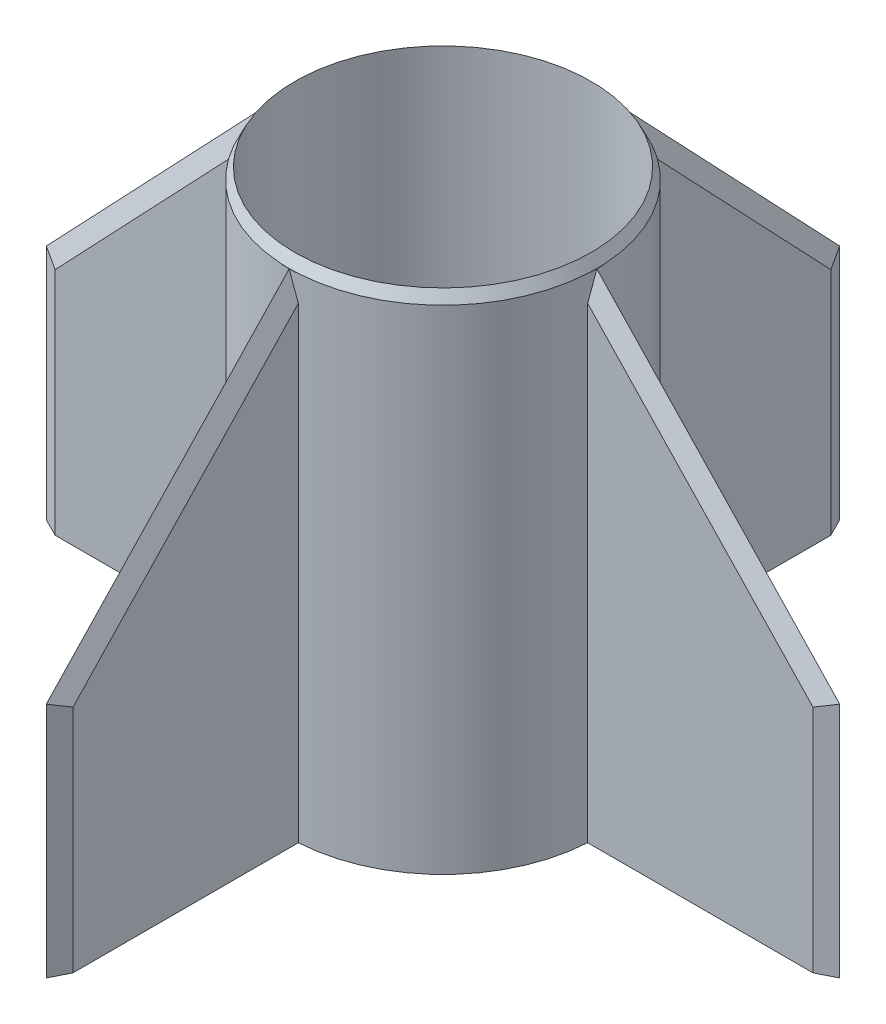
ISO-10303-21;
HEADER;
FILE_DESCRIPTION(('STEP AP214'),'2;1');
FILE_NAME('part.step','',(''),(''),'','','');
FILE_SCHEMA(('AUTOMOTIVE_DESIGN { 1 0 10303 214 1 1 1 1 }'));
ENDSEC;
DATA;
#1=APPLICATION_CONTEXT('core data for automotive mechanical design processes');
#2=APPLICATION_PROTOCOL_DEFINITION('international standard','automotive_design',2000,#1);
#3=PRODUCT_CONTEXT('',#1,'mechanical');
#4=PRODUCT('Part','Part','',(#3));
#5=PRODUCT_RELATED_PRODUCT_CATEGORY('part','',(#4));
#6=PRODUCT_DEFINITION_FORMATION('','',#4);
#7=PRODUCT_DEFINITION_CONTEXT('part definition',#1,'design');
#8=PRODUCT_DEFINITION('design','',#6,#7);
#9=PRODUCT_DEFINITION_SHAPE('','',#8);
#10=(LENGTH_UNIT() NAMED_UNIT(*) SI_UNIT(.MILLI.,.METRE.));
#11=(NAMED_UNIT(*) PLANE_ANGLE_UNIT() SI_UNIT($,.RADIAN.));
#12=(NAMED_UNIT(*) SI_UNIT($,.STERADIAN.) SOLID_ANGLE_UNIT());
#13=UNCERTAINTY_MEASURE_WITH_UNIT(LENGTH_MEASURE(1.E-05),#10,'distance_accuracy_value','');
#14=(GEOMETRIC_REPRESENTATION_CONTEXT(3) GLOBAL_UNCERTAINTY_ASSIGNED_CONTEXT((#13)) GLOBAL_UNIT_ASSIGNED_CONTEXT((#10,
#11,#12)) REPRESENTATION_CONTEXT('',''));
#15=CARTESIAN_POINT('',(0.,0.,0.));
#16=DIRECTION('',(0.,0.,1.));
#17=DIRECTION('',(1.,0.,0.));
#18=AXIS2_PLACEMENT_3D('',#15,#16,#17);
#19=CARTESIAN_POINT('',(89.646,0.691512734750105,2.00999999999999));
#20=DIRECTION('',(0.,0.,-1.));
#21=DIRECTION('',(0.,1.,0.));
#22=AXIS2_PLACEMENT_3D('',#19,#20,#21);
#23=PLANE('',#22);
#24=DIRECTION('',(-0.689048416394945,-0.724715309527554,0.));
#25=VECTOR('',#24,1.);
#26=CARTESIAN_POINT('',(28.5056006518278,172.724806964674,2.01));
#27=LINE('',#26,#25);
#28=CARTESIAN_POINT('',(-34.6931461105194,106.254732827857,2.01000000000001));
#29=VERTEX_POINT('',#28);
#30=CARTESIAN_POINT('',(-85.626,52.6854652794942,2.01000000000001));
#31=VERTEX_POINT('',#30);
#32=EDGE_CURVE('E608',#29,#31,#27,.T.);
#33=ORIENTED_EDGE('',*,*,#32,.T.);
#34=DIRECTION('',(0.,-1.,0.));
#35=VECTOR('',#34,1.);
#36=CARTESIAN_POINT('',(-85.626,114.59151273475,2.00999999999999));
#37=LINE('',#36,#35);
#38=CARTESIAN_POINT('',(-85.626,0.691512734750104,2.00999999999999));
#39=VERTEX_POINT('',#38);
#40=EDGE_CURVE('E523',#31,#39,#37,.T.);
#41=ORIENTED_EDGE('',*,*,#40,.T.);
#42=DIRECTION('',(-1.,0.,0.));
#43=VECTOR('',#42,1.);
#44=CARTESIAN_POINT('',(89.646,0.691512734750105,2.00999999999999));
#45=LINE('',#44,#43);
#46=CARTESIAN_POINT('',(-34.6931461105194,0.691512734750104,2.00999999999999));
#47=VERTEX_POINT('',#46);
#48=EDGE_CURVE('E275',#47,#39,#45,.T.);
#49=ORIENTED_EDGE('',*,*,#48,.F.);
#50=DIRECTION('',(0.,-1.,0.));
#51=VECTOR('',#50,1.);
#52=CARTESIAN_POINT('',(-34.6931461105194,114.59151273475,2.01));
#53=LINE('',#52,#51);
#54=EDGE_CURVE('E288',#47,#29,#53,.F.);
#55=ORIENTED_EDGE('',*,*,#54,.T.);
#56=EDGE_LOOP('',(#33,#41,#49,#55));
#57=FACE_BOUND('',#56,.T.);
#58=ADVANCED_FACE('F48',(#57),#23,.F.);
#59=CARTESIAN_POINT('',(-89.646,54.2915127347501,-89.6460246323529));
#60=DIRECTION('',(-0.724715309527554,0.689048416394945,0.));
#61=DIRECTION('',(-0.689048416394945,-0.724715309527554,0.));
#62=AXIS2_PLACEMENT_3D('',#59,#60,#61);
#63=PLANE('',#62);
#64=CARTESIAN_POINT('',(0.,148.577816994492,0.));
#65=DIRECTION('',(0.724715309527554,-0.689048416394945,0.));
#66=DIRECTION('',(-0.689048416394945,-0.724715309527554,0.));
#67=AXIS2_PLACEMENT_3D('',#64,#65,#66);
#68=ELLIPSE('',#67,50.4337905763261,34.7513235294118);
#69=CARTESIAN_POINT('',(-34.7513235294118,112.027676846322,0.));
#70=VERTEX_POINT('',#69);
#71=CARTESIAN_POINT('',(-34.6931461105194,112.088865675927,2.01000000000001));
#72=VERTEX_POINT('',#71);
#73=EDGE_CURVE('E224',#70,#72,#68,.F.);
#74=ORIENTED_EDGE('',*,*,#73,.T.);
#75=DIRECTION('',(0.,0.,1.));
#76=VECTOR('',#75,1.);
#77=CARTESIAN_POINT('',(-34.6931461105194,112.088865675927,-89.6460246323529));
#78=LINE('',#77,#76);
#79=CARTESIAN_POINT('',(-34.6931461105194,112.088865675927,-2.01000000000001));
#80=VERTEX_POINT('',#79);
#81=EDGE_CURVE('E227',#80,#72,#78,.T.);
#82=ORIENTED_EDGE('',*,*,#81,.F.);
#83=CARTESIAN_POINT('',(0.,148.577816994492,0.));
#84=DIRECTION('',(-0.724715309527554,0.689048416394945,0.));
#85=DIRECTION('',(-0.689048416394945,-0.724715309527554,0.));
#86=AXIS2_PLACEMENT_3D('',#83,#84,#85);
#87=ELLIPSE('',#86,50.4337905763261,34.7513235294118);
#88=EDGE_CURVE('E229',#70,#80,#87,.F.);
#89=ORIENTED_EDGE('',*,*,#88,.F.);
#90=EDGE_LOOP('',(#74,#82,#89));
#91=FACE_BOUND('',#90,.T.);
#92=ADVANCED_FACE('F226',(#91),#63,.T.);
#93=CARTESIAN_POINT('',(-85.626,114.59151273475,2.00999999999999));
#94=DIRECTION('',(-0.447213595499958,0.,0.894427190999916));
#95=DIRECTION('',(0.894427190999916,0.,0.447213595499958));
#96=AXIS2_PLACEMENT_3D('',#93,#94,#95);
#97=PLANE('',#96);
#98=ORIENTED_EDGE('',*,*,#40,.F.);
#99=DIRECTION('',(-0.842267914185756,0.336498069706901,-0.421133957092878));
#100=VECTOR('',#99,1.);
#101=CARTESIAN_POINT('',(-103.171506518848,59.695145900333,-6.76275325942397));
#102=LINE('',#101,#100);
#103=CARTESIAN_POINT('',(-89.646,54.2915127347501,0.));
#104=VERTEX_POINT('',#103);
#105=EDGE_CURVE('E235',#31,#104,#102,.T.);
#106=ORIENTED_EDGE('',*,*,#105,.T.);
#107=DIRECTION('',(0.,-1.,0.));
#108=VECTOR('',#107,1.);
#109=CARTESIAN_POINT('',(-89.646,114.59151273475,0.));
#110=LINE('',#109,#108);
#111=CARTESIAN_POINT('',(-89.646,0.691512734750104,0.));
#112=VERTEX_POINT('',#111);
#113=EDGE_CURVE('E524',#104,#112,#110,.T.);
#114=ORIENTED_EDGE('',*,*,#113,.T.);
#115=DIRECTION('',(-0.894427190999916,0.,-0.447213595499958));
#116=VECTOR('',#115,1.);
#117=CARTESIAN_POINT('',(-85.626,0.691512734750104,2.00999999999999));
#118=LINE('',#117,#116);
#119=EDGE_CURVE('E520',#39,#112,#118,.T.);
#120=ORIENTED_EDGE('',*,*,#119,.F.);
#121=EDGE_LOOP('',(#98,#106,#114,#120));
#122=FACE_BOUND('',#121,.T.);
#123=ADVANCED_FACE('F620',(#122),#97,.T.);
#124=CARTESIAN_POINT('',(89.646,112.088865675927,-2.01));
#125=DIRECTION('',(0.,0.,1.));
#126=DIRECTION('',(0.,-1.,0.));
#127=AXIS2_PLACEMENT_3D('',#124,#125,#126);
#128=PLANE('',#127);
#129=DIRECTION('',(0.689048416394945,-0.724715309527554,0.));
#130=VECTOR('',#129,1.);
#131=CARTESIAN_POINT('',(-28.5056006518278,172.724806964674,-2.01));
#132=LINE('',#131,#130);
#133=CARTESIAN_POINT('',(34.6931461105194,106.254732827857,-2.01000000000001));
#134=VERTEX_POINT('',#133);
#135=CARTESIAN_POINT('',(85.626,52.6854652794942,-2.01000000000001));
#136=VERTEX_POINT('',#135);
#137=EDGE_CURVE('E486',#134,#136,#132,.T.);
#138=ORIENTED_EDGE('',*,*,#137,.T.);
#139=DIRECTION('',(0.,-1.,0.));
#140=VECTOR('',#139,1.);
#141=CARTESIAN_POINT('',(85.626,114.59151273475,-2.00999999999999));
#142=LINE('',#141,#140);
#143=CARTESIAN_POINT('',(85.626,0.691512734750104,-2.00999999999999));
#144=VERTEX_POINT('',#143);
#145=EDGE_CURVE('E245',#136,#144,#142,.T.);
#146=ORIENTED_EDGE('',*,*,#145,.T.);
#147=DIRECTION('',(-1.,0.,0.));
#148=VECTOR('',#147,1.);
#149=CARTESIAN_POINT('',(89.646,0.691512734750106,-2.01000000000001));
#150=LINE('',#149,#148);
#151=CARTESIAN_POINT('',(34.6931461105194,0.691512734750106,-2.01000000000001));
#152=VERTEX_POINT('',#151);
#153=EDGE_CURVE('E544',#144,#152,#150,.T.);
#154=ORIENTED_EDGE('',*,*,#153,.T.);
#155=DIRECTION('',(0.,-1.,0.));
#156=VECTOR('',#155,1.);
#157=CARTESIAN_POINT('',(34.6931461105194,114.59151273475,-2.01));
#158=LINE('',#157,#156);
#159=EDGE_CURVE('E273',#152,#134,#158,.F.);
#160=ORIENTED_EDGE('',*,*,#159,.T.);
#161=EDGE_LOOP('',(#138,#146,#154,#160));
#162=FACE_BOUND('',#161,.T.);
#163=ADVANCED_FACE('F739',(#162),#128,.F.);
#164=CARTESIAN_POINT('',(85.626,114.59151273475,-2.00999999999999));
#165=DIRECTION('',(0.447213595499958,0.,-0.894427190999916));
#166=DIRECTION('',(-0.894427190999916,0.,-0.447213595499958));
#167=AXIS2_PLACEMENT_3D('',#164,#165,#166);
#168=PLANE('',#167);
#169=ORIENTED_EDGE('',*,*,#145,.F.);
#170=DIRECTION('',(0.842267914185756,0.336498069706901,0.421133957092878));
#171=VECTOR('',#170,1.);
#172=CARTESIAN_POINT('',(103.171506518848,59.695145900333,6.76275325942397));
#173=LINE('',#172,#171);
#174=CARTESIAN_POINT('',(89.646,54.2915127347501,0.));
#175=VERTEX_POINT('',#174);
#176=EDGE_CURVE('E57',#136,#175,#173,.T.);
#177=ORIENTED_EDGE('',*,*,#176,.T.);
#178=DIRECTION('',(0.,-1.,0.));
#179=VECTOR('',#178,1.);
#180=CARTESIAN_POINT('',(89.646,114.59151273475,0.));
#181=LINE('',#180,#179);
#182=CARTESIAN_POINT('',(89.646,0.691512734750104,0.));
#183=VERTEX_POINT('',#182);
#184=EDGE_CURVE('E537',#175,#183,#181,.T.);
#185=ORIENTED_EDGE('',*,*,#184,.T.);
#186=DIRECTION('',(0.894427190999916,0.,0.447213595499958));
#187=VECTOR('',#186,1.);
#188=CARTESIAN_POINT('',(85.626,0.691512734750104,-2.00999999999999));
#189=LINE('',#188,#187);
#190=EDGE_CURVE('E528',#144,#183,#189,.T.);
#191=ORIENTED_EDGE('',*,*,#190,.F.);
#192=EDGE_LOOP('',(#169,#177,#185,#191));
#193=FACE_BOUND('',#192,.T.);
#194=ADVANCED_FACE('F588',(#193),#168,.T.);
#195=CARTESIAN_POINT('',(0.,0.691512734750104,0.));
#196=DIRECTION('',(0.,1.,0.));
#197=DIRECTION('',(0.,0.,1.));
#198=AXIS2_PLACEMENT_3D('',#195,#196,#197);
#199=PLANE('',#198);
#200=CARTESIAN_POINT('',(0.,0.691512734750104,0.));
#201=DIRECTION('',(0.,1.,0.));
#202=DIRECTION('',(0.,0.,1.));
#203=AXIS2_PLACEMENT_3D('',#200,#201,#202);
#204=CIRCLE('',#203,33.5);
#205=CARTESIAN_POINT('',(0.,0.691512734750104,33.5));
#206=VERTEX_POINT('',#205);
#207=EDGE_CURVE('E421',#206,#206,#204,.T.);
#208=ORIENTED_EDGE('',*,*,#207,.T.);
#209=EDGE_LOOP('',(#208));
#210=FACE_BOUND('',#209,.T.);
#211=ORIENTED_EDGE('',*,*,#119,.T.);
#212=DIRECTION('',(-0.894427190999916,0.,0.447213595499958));
#213=VECTOR('',#212,1.);
#214=CARTESIAN_POINT('',(-85.626,0.691512734750104,-2.00999999999999));
#215=LINE('',#214,#213);
#216=CARTESIAN_POINT('',(-85.626,0.691512734750104,-2.00999999999999));
#217=VERTEX_POINT('',#216);
#218=EDGE_CURVE('E505',#217,#112,#215,.T.);
#219=ORIENTED_EDGE('',*,*,#218,.F.);
#220=CARTESIAN_POINT('',(-34.6931461105194,0.691512734750106,-2.01000000000001));
#221=VERTEX_POINT('',#220);
#222=EDGE_CURVE('E543',#221,#217,#150,.T.);
#223=ORIENTED_EDGE('',*,*,#222,.F.);
#224=CARTESIAN_POINT('',(0.,0.691512734750104,0.));
#225=DIRECTION('',(0.,1.,0.));
#226=DIRECTION('',(0.,0.,1.));
#227=AXIS2_PLACEMENT_3D('',#224,#225,#226);
#228=CIRCLE('',#227,34.7513235294118);
#229=CARTESIAN_POINT('',(-2.00999999999999,0.691512734750104,-34.6931461105194));
#230=VERTEX_POINT('',#229);
#231=EDGE_CURVE('E420',#230,#221,#228,.T.);
#232=ORIENTED_EDGE('',*,*,#231,.F.);
#233=DIRECTION('',(0.,0.,-1.));
#234=VECTOR('',#233,1.);
#235=CARTESIAN_POINT('',(-2.00999999999999,0.691512734750104,89.646));
#236=LINE('',#235,#234);
#237=CARTESIAN_POINT('',(-2.00999999999999,0.69151027151481,-85.626));
#238=VERTEX_POINT('',#237);
#239=EDGE_CURVE('E373',#230,#238,#236,.T.);
#240=ORIENTED_EDGE('',*,*,#239,.T.);
#241=DIRECTION('',(-0.447213595499958,0.,0.894427190999916));
#242=VECTOR('',#241,1.);
#243=CARTESIAN_POINT('',(-35.8584,0.691512734750104,-17.9292));
#244=LINE('',#243,#242);
#245=CARTESIAN_POINT('',(0.,0.691512734750104,-89.646));
#246=VERTEX_POINT('',#245);
#247=EDGE_CURVE('E367',#246,#238,#244,.T.);
#248=ORIENTED_EDGE('',*,*,#247,.F.);
#249=DIRECTION('',(0.447213595499958,0.,0.894427190999916));
#250=VECTOR('',#249,1.);
#251=CARTESIAN_POINT('',(35.8584,0.691512734750104,-17.9292));
#252=LINE('',#251,#250);
#253=CARTESIAN_POINT('',(2.00999999999999,0.691512734750104,-85.626));
#254=VERTEX_POINT('',#253);
#255=EDGE_CURVE('E349',#246,#254,#252,.T.);
#256=ORIENTED_EDGE('',*,*,#255,.T.);
#257=DIRECTION('',(0.,0.,-1.));
#258=VECTOR('',#257,1.);
#259=CARTESIAN_POINT('',(2.01000000000001,0.691512734750105,89.646));
#260=LINE('',#259,#258);
#261=CARTESIAN_POINT('',(2.01000000000001,0.691512734750105,-34.6931461105194));
#262=VERTEX_POINT('',#261);
#263=EDGE_CURVE('E403',#262,#254,#260,.T.);
#264=ORIENTED_EDGE('',*,*,#263,.F.);
#265=EDGE_CURVE('E418',#152,#262,#228,.T.);
#266=ORIENTED_EDGE('',*,*,#265,.F.);
#267=ORIENTED_EDGE('',*,*,#153,.F.);
#268=ORIENTED_EDGE('',*,*,#190,.T.);
#269=DIRECTION('',(0.894427190999916,0.,-0.447213595499958));
#270=VECTOR('',#269,1.);
#271=CARTESIAN_POINT('',(85.626,0.691512734750104,2.00999999999999));
#272=LINE('',#271,#270);
#273=CARTESIAN_POINT('',(85.626,0.691512734750104,2.00999999999999));
#274=VERTEX_POINT('',#273);
#275=EDGE_CURVE('E244',#274,#183,#272,.T.);
#276=ORIENTED_EDGE('',*,*,#275,.F.);
#277=CARTESIAN_POINT('',(34.6931461105194,0.691512734750104,2.00999999999999));
#278=VERTEX_POINT('',#277);
#279=EDGE_CURVE('E268',#274,#278,#45,.T.);
#280=ORIENTED_EDGE('',*,*,#279,.T.);
#281=CARTESIAN_POINT('',(2.01000000000001,0.691512734750105,34.6931461105194));
#282=VERTEX_POINT('',#281);
#283=EDGE_CURVE('E381',#282,#278,#228,.T.);
#284=ORIENTED_EDGE('',*,*,#283,.F.);
#285=CARTESIAN_POINT('',(2.00999999999999,0.691512734750104,85.626));
#286=VERTEX_POINT('',#285);
#287=EDGE_CURVE('E404',#286,#282,#260,.T.);
#288=ORIENTED_EDGE('',*,*,#287,.F.);
#289=DIRECTION('',(0.447213595499958,0.,-0.894427190999916));
#290=VECTOR('',#289,1.);
#291=CARTESIAN_POINT('',(35.8584,0.691512734750104,17.9292));
#292=LINE('',#291,#290);
#293=CARTESIAN_POINT('',(0.,0.691512734750132,89.646));
#294=VERTEX_POINT('',#293);
#295=EDGE_CURVE('E356',#294,#286,#292,.T.);
#296=ORIENTED_EDGE('',*,*,#295,.F.);
#297=DIRECTION('',(-0.447213595499958,0.,-0.894427190999916));
#298=VECTOR('',#297,1.);
#299=CARTESIAN_POINT('',(-35.8584,0.691512734750104,17.9292));
#300=LINE('',#299,#298);
#301=CARTESIAN_POINT('',(-2.00999999999999,0.691512734750104,85.626));
#302=VERTEX_POINT('',#301);
#303=EDGE_CURVE('E390',#294,#302,#300,.T.);
#304=ORIENTED_EDGE('',*,*,#303,.T.);
#305=CARTESIAN_POINT('',(-2.00999999999999,0.691512734750104,34.6931461105194));
#306=VERTEX_POINT('',#305);
#307=EDGE_CURVE('E411',#302,#306,#236,.T.);
#308=ORIENTED_EDGE('',*,*,#307,.T.);
#309=EDGE_CURVE('E419',#47,#306,#228,.T.);
#310=ORIENTED_EDGE('',*,*,#309,.F.);
#311=ORIENTED_EDGE('',*,*,#48,.T.);
#312=EDGE_LOOP('',(#211,#219,#223,#232,#240,#248,#256,#264,#266,#267,#268,#276,#280,#284,#288,
#296,#304,#308,#310,#311));
#313=FACE_BOUND('',#312,.T.);
#314=ADVANCED_FACE('F461',(#210,#313),#199,.F.);
#315=CARTESIAN_POINT('',(89.646,54.2915127347501,-89.6460246323529));
#316=DIRECTION('',(-0.724715309527554,-0.689048416394945,0.));
#317=DIRECTION('',(0.689048416394945,-0.724715309527554,0.));
#318=AXIS2_PLACEMENT_3D('',#315,#316,#317);
#319=PLANE('',#318);
#320=DIRECTION('',(0.,0.,1.));
#321=VECTOR('',#320,1.);
#322=CARTESIAN_POINT('',(34.6931461105194,112.088865675927,-89.6460246323529));
#323=LINE('',#322,#321);
#324=CARTESIAN_POINT('',(34.6931461105194,112.088865675927,-2.01000000000001));
#325=VERTEX_POINT('',#324);
#326=CARTESIAN_POINT('',(34.6931461105194,112.088865675927,2.01000000000001));
#327=VERTEX_POINT('',#326);
#328=EDGE_CURVE('E494',#325,#327,#323,.T.);
#329=ORIENTED_EDGE('',*,*,#328,.T.);
#330=CARTESIAN_POINT('',(0.,148.577816994492,0.));
#331=DIRECTION('',(0.724715309527554,0.689048416394945,0.));
#332=DIRECTION('',(0.689048416394945,-0.724715309527554,0.));
#333=AXIS2_PLACEMENT_3D('',#330,#331,#332);
#334=ELLIPSE('',#333,50.4337905763261,34.7513235294118);
#335=CARTESIAN_POINT('',(34.7513235294118,112.027676846322,0.));
#336=VERTEX_POINT('',#335);
#337=EDGE_CURVE('E476',#336,#327,#334,.F.);
#338=ORIENTED_EDGE('',*,*,#337,.F.);
#339=CARTESIAN_POINT('',(0.,148.577816994492,0.));
#340=DIRECTION('',(-0.724715309527554,-0.689048416394945,0.));
#341=DIRECTION('',(0.689048416394945,-0.724715309527554,0.));
#342=AXIS2_PLACEMENT_3D('',#339,#340,#341);
#343=ELLIPSE('',#342,50.4337905763261,34.7513235294118);
#344=EDGE_CURVE('E492',#336,#325,#343,.F.);
#345=ORIENTED_EDGE('',*,*,#344,.T.);
#346=EDGE_LOOP('',(#329,#338,#345));
#347=FACE_BOUND('',#346,.T.);
#348=ADVANCED_FACE('F491',(#347),#319,.F.);
#349=DIRECTION('',(0.,-1.,0.));
#350=VECTOR('',#349,1.);
#351=CARTESIAN_POINT('',(-85.626,114.59151273475,-2.00999999999999));
#352=LINE('',#351,#350);
#353=CARTESIAN_POINT('',(-85.626,52.6854652794943,-2.00999999999999));
#354=VERTEX_POINT('',#353);
#355=EDGE_CURVE('E517',#354,#217,#352,.T.);
#356=ORIENTED_EDGE('',*,*,#355,.F.);
#357=DIRECTION('',(-0.689048416394945,-0.724715309527554,0.));
#358=VECTOR('',#357,1.);
#359=CARTESIAN_POINT('',(28.5056006518278,172.724806964674,-2.01));
#360=LINE('',#359,#358);
#361=CARTESIAN_POINT('',(-34.6931461105194,106.254732827857,-2.01000000000001));
#362=VERTEX_POINT('',#361);
#363=EDGE_CURVE('E64',#362,#354,#360,.T.);
#364=ORIENTED_EDGE('',*,*,#363,.F.);
#365=DIRECTION('',(0.,-1.,0.));
#366=VECTOR('',#365,1.);
#367=CARTESIAN_POINT('',(-34.6931461105194,114.59151273475,-2.01));
#368=LINE('',#367,#366);
#369=EDGE_CURVE('E282',#362,#221,#368,.T.);
#370=ORIENTED_EDGE('',*,*,#369,.T.);
#371=ORIENTED_EDGE('',*,*,#222,.T.);
#372=EDGE_LOOP('',(#356,#364,#370,#371));
#373=FACE_BOUND('',#372,.T.);
#374=ADVANCED_FACE('F555',(#373),#128,.F.);
#375=CARTESIAN_POINT('',(0.,114.59151273475,0.));
#376=DIRECTION('',(0.,-1.,0.));
#377=DIRECTION('',(0.,0.,-1.));
#378=AXIS2_PLACEMENT_3D('',#375,#376,#377);
#379=CYLINDRICAL_SURFACE('',#378,34.7513235294118);
#380=ORIENTED_EDGE('',*,*,#54,.F.);
#381=ORIENTED_EDGE('',*,*,#309,.T.);
#382=DIRECTION('',(0.,-1.,0.));
#383=VECTOR('',#382,1.);
#384=CARTESIAN_POINT('',(-2.01000000000001,114.59151273475,34.6931461105194));
#385=LINE('',#384,#383);
#386=CARTESIAN_POINT('',(-2.01000000000003,106.254732827857,34.6931461105194));
#387=VERTEX_POINT('',#386);
#388=EDGE_CURVE('E431',#387,#306,#385,.T.);
#389=ORIENTED_EDGE('',*,*,#388,.F.);
#390=CARTESIAN_POINT('',(0.,148.577816994492,0.));
#391=DIRECTION('',(0.894427190999916,-0.308151819769536,-0.324102539287682));
#392=DIRECTION('',(-0.289717850206181,-0.951337193624177,0.104981480743915));
#393=AXIS2_PLACEMENT_3D('',#390,#391,#392);
#394=ELLIPSE('',#393,112.773384091653,34.7513235294118);
#395=CARTESIAN_POINT('',(0.,112.027676846322,34.7513235294118));
#396=VERTEX_POINT('',#395);
#397=EDGE_CURVE('E323',#387,#396,#394,.F.);
#398=ORIENTED_EDGE('',*,*,#397,.T.);
#399=CARTESIAN_POINT('',(0.,148.577816994492,0.));
#400=DIRECTION('',(0.,0.689048416394945,0.724715309527554));
#401=DIRECTION('',(0.,-0.724715309527554,0.689048416394945));
#402=AXIS2_PLACEMENT_3D('',#399,#400,#401);
#403=ELLIPSE('',#402,50.433790576326,34.7513235294118);
#404=CARTESIAN_POINT('',(-2.01000000000003,112.088865675927,34.6931461105194));
#405=VERTEX_POINT('',#404);
#406=EDGE_CURVE('E252',#396,#405,#403,.F.);
#407=ORIENTED_EDGE('',*,*,#406,.T.);
#408=CARTESIAN_POINT('',(0.,112.088865675927,0.));
#409=DIRECTION('',(0.,1.,0.));
#410=DIRECTION('',(0.,0.,1.));
#411=AXIS2_PLACEMENT_3D('',#408,#409,#410);
#412=CIRCLE('',#411,34.7513235294118);
#413=EDGE_CURVE('E248',#72,#405,#412,.T.);
#414=ORIENTED_EDGE('',*,*,#413,.F.);
#415=ORIENTED_EDGE('',*,*,#73,.F.);
#416=CARTESIAN_POINT('',(0.,148.577816994492,0.));
#417=DIRECTION('',(-0.324102539287683,0.308151819769536,0.894427190999915));
#418=DIRECTION('',(-0.104981480743916,-0.951337193624176,0.289717850206182));
#419=AXIS2_PLACEMENT_3D('',#416,#417,#418);
#420=ELLIPSE('',#419,112.773384091653,34.7513235294118);
#421=EDGE_CURVE('E236',#29,#70,#420,.F.);
#422=ORIENTED_EDGE('',*,*,#421,.F.);
#423=EDGE_LOOP('',(#380,#381,#389,#398,#407,#414,#415,#422));
#424=FACE_BOUND('',#423,.T.);
#425=ADVANCED_FACE('F50',(#424),#379,.T.);
#426=ORIENTED_EDGE('',*,*,#369,.F.);
#427=CARTESIAN_POINT('',(0.,148.577816994492,0.));
#428=DIRECTION('',(0.324102539287683,-0.308151819769536,0.894427190999915));
#429=DIRECTION('',(-0.104981480743916,-0.951337193624176,-0.289717850206182));
#430=AXIS2_PLACEMENT_3D('',#427,#428,#429);
#431=ELLIPSE('',#430,112.773384091653,34.7513235294118);
#432=EDGE_CURVE('E598',#362,#70,#431,.F.);
#433=ORIENTED_EDGE('',*,*,#432,.T.);
#434=ORIENTED_EDGE('',*,*,#88,.T.);
#435=CARTESIAN_POINT('',(-2.01000000000003,112.088865675927,-34.6931461105194));
#436=VERTEX_POINT('',#435);
#437=EDGE_CURVE('E257',#436,#80,#412,.T.);
#438=ORIENTED_EDGE('',*,*,#437,.F.);
#439=CARTESIAN_POINT('',(0.,148.577816994492,0.));
#440=DIRECTION('',(0.,-0.689048416394945,0.724715309527554));
#441=DIRECTION('',(0.,-0.724715309527554,-0.689048416394945));
#442=AXIS2_PLACEMENT_3D('',#439,#440,#441);
#443=ELLIPSE('',#442,50.433790576326,34.7513235294118);
#444=CARTESIAN_POINT('',(0.,112.027676846322,-34.7513235294118));
#445=VERTEX_POINT('',#444);
#446=EDGE_CURVE('E332',#445,#436,#443,.F.);
#447=ORIENTED_EDGE('',*,*,#446,.F.);
#448=CARTESIAN_POINT('',(0.,148.577816994492,0.));
#449=DIRECTION('',(-0.894427190999916,0.308151819769536,-0.324102539287682));
#450=DIRECTION('',(-0.289717850206181,-0.951337193624177,-0.104981480743915));
#451=AXIS2_PLACEMENT_3D('',#448,#449,#450);
#452=ELLIPSE('',#451,112.773384091653,34.7513235294118);
#453=CARTESIAN_POINT('',(-2.01000000000003,106.254732827857,-34.6931461105194));
#454=VERTEX_POINT('',#453);
#455=EDGE_CURVE('E336',#454,#445,#452,.F.);
#456=ORIENTED_EDGE('',*,*,#455,.F.);
#457=DIRECTION('',(0.,-1.,0.));
#458=VECTOR('',#457,1.);
#459=CARTESIAN_POINT('',(-2.01000000000001,114.59151273475,-34.6931461105194));
#460=LINE('',#459,#458);
#461=EDGE_CURVE('E435',#230,#454,#460,.F.);
#462=ORIENTED_EDGE('',*,*,#461,.F.);
#463=ORIENTED_EDGE('',*,*,#231,.T.);
#464=EDGE_LOOP('',(#426,#433,#434,#438,#447,#456,#462,#463));
#465=FACE_BOUND('',#464,.T.);
#466=ADVANCED_FACE('F563',(#465),#379,.T.);
#467=DIRECTION('',(0.,-1.,0.));
#468=VECTOR('',#467,1.);
#469=CARTESIAN_POINT('',(34.6931461105194,114.59151273475,2.01));
#470=LINE('',#469,#468);
#471=CARTESIAN_POINT('',(34.6931461105194,106.254732827857,2.01000000000001));
#472=VERTEX_POINT('',#471);
#473=EDGE_CURVE('E285',#472,#278,#470,.T.);
#474=ORIENTED_EDGE('',*,*,#473,.F.);
#475=CARTESIAN_POINT('',(0.,148.577816994492,0.));
#476=DIRECTION('',(-0.324102539287683,-0.308151819769536,-0.894427190999915));
#477=DIRECTION('',(0.104981480743916,-0.951337193624176,0.289717850206182));
#478=AXIS2_PLACEMENT_3D('',#475,#476,#477);
#479=ELLIPSE('',#478,112.773384091653,34.7513235294118);
#480=EDGE_CURVE('E473',#472,#336,#479,.F.);
#481=ORIENTED_EDGE('',*,*,#480,.T.);
#482=ORIENTED_EDGE('',*,*,#337,.T.);
#483=CARTESIAN_POINT('',(2.01000000000003,112.088865675927,34.6931461105194));
#484=VERTEX_POINT('',#483);
#485=EDGE_CURVE('E261',#484,#327,#412,.T.);
#486=ORIENTED_EDGE('',*,*,#485,.F.);
#487=CARTESIAN_POINT('',(0.,148.577816994492,0.));
#488=DIRECTION('',(0.,-0.689048416394945,-0.724715309527554));
#489=DIRECTION('',(0.,-0.724715309527554,0.689048416394945));
#490=AXIS2_PLACEMENT_3D('',#487,#488,#489);
#491=ELLIPSE('',#490,50.433790576326,34.7513235294118);
#492=EDGE_CURVE('E293',#396,#484,#491,.F.);
#493=ORIENTED_EDGE('',*,*,#492,.F.);
#494=CARTESIAN_POINT('',(0.,148.577816994492,0.));
#495=DIRECTION('',(0.894427190999916,0.308151819769536,0.324102539287682));
#496=DIRECTION('',(0.289717850206181,-0.951337193624177,0.104981480743915));
#497=AXIS2_PLACEMENT_3D('',#494,#495,#496);
#498=ELLIPSE('',#497,112.773384091653,34.7513235294118);
#499=CARTESIAN_POINT('',(2.01000000000003,106.254732827857,34.6931461105194));
#500=VERTEX_POINT('',#499);
#501=EDGE_CURVE('E297',#500,#396,#498,.F.);
#502=ORIENTED_EDGE('',*,*,#501,.F.);
#503=DIRECTION('',(0.,-1.,0.));
#504=VECTOR('',#503,1.);
#505=CARTESIAN_POINT('',(2.01000000000001,114.59151273475,34.6931461105194));
#506=LINE('',#505,#504);
#507=EDGE_CURVE('E408',#282,#500,#506,.F.);
#508=ORIENTED_EDGE('',*,*,#507,.F.);
#509=ORIENTED_EDGE('',*,*,#283,.T.);
#510=EDGE_LOOP('',(#474,#481,#482,#486,#493,#502,#508,#509));
#511=FACE_BOUND('',#510,.T.);
#512=ADVANCED_FACE('F457',(#511),#379,.T.);
#513=ORIENTED_EDGE('',*,*,#159,.F.);
#514=ORIENTED_EDGE('',*,*,#265,.T.);
#515=DIRECTION('',(0.,-1.,0.));
#516=VECTOR('',#515,1.);
#517=CARTESIAN_POINT('',(2.01000000000001,114.59151273475,-34.6931461105194));
#518=LINE('',#517,#516);
#519=CARTESIAN_POINT('',(2.01000000000003,106.254732827857,-34.6931461105194));
#520=VERTEX_POINT('',#519);
#521=EDGE_CURVE('E438',#520,#262,#518,.T.);
#522=ORIENTED_EDGE('',*,*,#521,.F.);
#523=CARTESIAN_POINT('',(0.,148.577816994492,0.));
#524=DIRECTION('',(-0.894427190999916,-0.308151819769536,0.324102539287682));
#525=DIRECTION('',(0.289717850206181,-0.951337193624177,-0.104981480743915));
#526=AXIS2_PLACEMENT_3D('',#523,#524,#525);
#527=ELLIPSE('',#526,112.773384091653,34.7513235294118);
#528=EDGE_CURVE('E311',#520,#445,#527,.F.);
#529=ORIENTED_EDGE('',*,*,#528,.T.);
#530=CARTESIAN_POINT('',(0.,148.577816994492,0.));
#531=DIRECTION('',(0.,0.689048416394945,-0.724715309527554));
#532=DIRECTION('',(0.,-0.724715309527554,-0.689048416394945));
#533=AXIS2_PLACEMENT_3D('',#530,#531,#532);
#534=ELLIPSE('',#533,50.433790576326,34.7513235294118);
#535=CARTESIAN_POINT('',(2.01000000000003,112.088865675927,-34.6931461105194));
#536=VERTEX_POINT('',#535);
#537=EDGE_CURVE('E306',#445,#536,#534,.F.);
#538=ORIENTED_EDGE('',*,*,#537,.T.);
#539=EDGE_CURVE('E260',#325,#536,#412,.T.);
#540=ORIENTED_EDGE('',*,*,#539,.F.);
#541=ORIENTED_EDGE('',*,*,#344,.F.);
#542=CARTESIAN_POINT('',(0.,148.577816994492,0.));
#543=DIRECTION('',(0.324102539287683,0.308151819769536,-0.894427190999915));
#544=DIRECTION('',(0.104981480743916,-0.951337193624176,-0.289717850206182));
#545=AXIS2_PLACEMENT_3D('',#542,#543,#544);
#546=ELLIPSE('',#545,112.773384091653,34.7513235294118);
#547=EDGE_CURVE('E485',#134,#336,#546,.F.);
#548=ORIENTED_EDGE('',*,*,#547,.F.);
#549=EDGE_LOOP('',(#513,#514,#522,#529,#538,#540,#541,#548));
#550=FACE_BOUND('',#549,.T.);
#551=ADVANCED_FACE('F502',(#550),#379,.T.);
#552=CARTESIAN_POINT('',(0.,114.59151273475,0.));
#553=DIRECTION('',(0.,-1.,0.));
#554=DIRECTION('',(0.,0.,-1.));
#555=AXIS2_PLACEMENT_3D('',#552,#553,#554);
#556=CYLINDRICAL_SURFACE('',#555,33.5);
#557=ORIENTED_EDGE('',*,*,#207,.F.);
#558=EDGE_LOOP('',(#557));
#559=FACE_BOUND('',#558,.T.);
#560=CARTESIAN_POINT('',(0.,114.59151273475,0.));
#561=DIRECTION('',(0.,1.,0.));
#562=DIRECTION('',(0.,0.,1.));
#563=AXIS2_PLACEMENT_3D('',#560,#561,#562);
#564=CIRCLE('',#563,33.5);
#565=CARTESIAN_POINT('',(0.,114.59151273475,33.5));
#566=VERTEX_POINT('',#565);
#567=EDGE_CURVE('E425',#566,#566,#564,.T.);
#568=ORIENTED_EDGE('',*,*,#567,.T.);
#569=EDGE_LOOP('',(#568));
#570=FACE_BOUND('',#569,.T.);
#571=ADVANCED_FACE('F705',(#559,#570),#556,.F.);
#572=CARTESIAN_POINT('',(2.01000000000001,0.691512734750105,89.646));
#573=DIRECTION('',(-1.,0.,0.));
#574=DIRECTION('',(0.,-1.,0.));
#575=AXIS2_PLACEMENT_3D('',#572,#573,#574);
#576=PLANE('',#575);
#577=DIRECTION('',(0.,-0.724715309527554,0.689048416394945));
#578=VECTOR('',#577,1.);
#579=CARTESIAN_POINT('',(2.01000000000004,172.724819265182,-28.5056123469666));
#580=LINE('',#579,#578);
#581=CARTESIAN_POINT('',(2.01000000000001,52.6854652794943,85.6259999999999));
#582=VERTEX_POINT('',#581);
#583=EDGE_CURVE('E292',#500,#582,#580,.T.);
#584=ORIENTED_EDGE('',*,*,#583,.T.);
#585=DIRECTION('',(0.,-1.,0.));
#586=VECTOR('',#585,1.);
#587=CARTESIAN_POINT('',(2.00999999999999,114.59151273475,85.626));
#588=LINE('',#587,#586);
#589=EDGE_CURVE('E353',#582,#286,#588,.T.);
#590=ORIENTED_EDGE('',*,*,#589,.T.);
#591=ORIENTED_EDGE('',*,*,#287,.T.);
#592=ORIENTED_EDGE('',*,*,#507,.T.);
#593=EDGE_LOOP('',(#584,#590,#591,#592));
#594=FACE_BOUND('',#593,.T.);
#595=ADVANCED_FACE('F450',(#594),#576,.F.);
#596=CARTESIAN_POINT('',(34.7513235294118,112.088865675927,34.6931461105194));
#597=DIRECTION('',(0.,-0.689048416394945,-0.724715309527554));
#598=DIRECTION('',(0.,0.724715309527554,-0.689048416394945));
#599=AXIS2_PLACEMENT_3D('',#596,#597,#598);
#600=PLANE('',#599);
#601=ORIENTED_EDGE('',*,*,#406,.F.);
#602=ORIENTED_EDGE('',*,*,#492,.T.);
#603=DIRECTION('',(-1.,0.,0.));
#604=VECTOR('',#603,1.);
#605=CARTESIAN_POINT('',(34.7513235294118,112.088865675927,34.6931461105194));
#606=LINE('',#605,#604);
#607=EDGE_CURVE('E400',#484,#405,#606,.T.);
#608=ORIENTED_EDGE('',*,*,#607,.T.);
#609=EDGE_LOOP('',(#601,#602,#608));
#610=FACE_BOUND('',#609,.T.);
#611=ADVANCED_FACE('F639',(#610),#600,.F.);
#612=CARTESIAN_POINT('',(0.,114.59151273475,89.646));
#613=DIRECTION('',(0.894427190999916,0.,0.447213595499958));
#614=DIRECTION('',(0.447213595499958,0.,-0.894427190999916));
#615=AXIS2_PLACEMENT_3D('',#612,#613,#614);
#616=PLANE('',#615);
#617=ORIENTED_EDGE('',*,*,#589,.F.);
#618=DIRECTION('',(-0.421133957092877,0.336498069706904,0.842267914185755));
#619=VECTOR('',#618,1.);
#620=CARTESIAN_POINT('',(-8.54515904808195,61.1193390750135,106.736318096164));
#621=LINE('',#620,#619);
#622=CARTESIAN_POINT('',(0.,54.2915127347502,89.646));
#623=VERTEX_POINT('',#622);
#624=EDGE_CURVE('E296',#582,#623,#621,.T.);
#625=ORIENTED_EDGE('',*,*,#624,.T.);
#626=DIRECTION('',(0.,-1.,0.));
#627=VECTOR('',#626,1.);
#628=CARTESIAN_POINT('',(0.,114.59151273475,89.646));
#629=LINE('',#628,#627);
#630=EDGE_CURVE('E386',#623,#294,#629,.T.);
#631=ORIENTED_EDGE('',*,*,#630,.T.);
#632=ORIENTED_EDGE('',*,*,#295,.T.);
#633=EDGE_LOOP('',(#617,#625,#631,#632));
#634=FACE_BOUND('',#633,.T.);
#635=ADVANCED_FACE('F687',(#634),#616,.T.);
#636=CARTESIAN_POINT('',(-2.01000000000001,112.088865675927,89.646));
#637=DIRECTION('',(1.,0.,0.));
#638=DIRECTION('',(0.,1.,0.));
#639=AXIS2_PLACEMENT_3D('',#636,#637,#638);
#640=PLANE('',#639);
#641=DIRECTION('',(0.,-0.724715309527554,-0.689048416394945));
#642=VECTOR('',#641,1.);
#643=CARTESIAN_POINT('',(-2.01000000000004,172.724819265182,28.5056123469666));
#644=LINE('',#643,#642);
#645=CARTESIAN_POINT('',(-2.01000000000001,52.6854652794943,-85.6259999999999));
#646=VERTEX_POINT('',#645);
#647=EDGE_CURVE('E331',#454,#646,#644,.T.);
#648=ORIENTED_EDGE('',*,*,#647,.T.);
#649=DIRECTION('',(0.,-1.,0.));
#650=VECTOR('',#649,1.);
#651=CARTESIAN_POINT('',(-2.00999999999999,114.59151273475,-85.626));
#652=LINE('',#651,#650);
#653=EDGE_CURVE('E364',#646,#238,#652,.T.);
#654=ORIENTED_EDGE('',*,*,#653,.T.);
#655=ORIENTED_EDGE('',*,*,#239,.F.);
#656=ORIENTED_EDGE('',*,*,#461,.T.);
#657=EDGE_LOOP('',(#648,#654,#655,#656));
#658=FACE_BOUND('',#657,.T.);
#659=ADVANCED_FACE('F650',(#658),#640,.F.);
#660=CARTESIAN_POINT('',(0.,114.59151273475,-89.646));
#661=DIRECTION('',(-0.894427190999916,0.,-0.447213595499958));
#662=DIRECTION('',(-0.447213595499958,0.,0.894427190999916));
#663=AXIS2_PLACEMENT_3D('',#660,#661,#662);
#664=PLANE('',#663);
#665=ORIENTED_EDGE('',*,*,#653,.F.);
#666=DIRECTION('',(0.421133957092877,0.336498069706904,-0.842267914185755));
#667=VECTOR('',#666,1.);
#668=CARTESIAN_POINT('',(8.54515904808195,61.1193390750135,-106.736318096164));
#669=LINE('',#668,#667);
#670=CARTESIAN_POINT('',(0.,54.2915127347501,-89.646));
#671=VERTEX_POINT('',#670);
#672=EDGE_CURVE('E376',#646,#671,#669,.T.);
#673=ORIENTED_EDGE('',*,*,#672,.T.);
#674=DIRECTION('',(0.,-1.,0.));
#675=VECTOR('',#674,1.);
#676=CARTESIAN_POINT('',(0.,114.59151273475,-89.646));
#677=LINE('',#676,#675);
#678=EDGE_CURVE('E360',#671,#246,#677,.T.);
#679=ORIENTED_EDGE('',*,*,#678,.T.);
#680=ORIENTED_EDGE('',*,*,#247,.T.);
#681=EDGE_LOOP('',(#665,#673,#679,#680));
#682=FACE_BOUND('',#681,.T.);
#683=ADVANCED_FACE('F691',(#682),#664,.T.);
#684=CARTESIAN_POINT('',(34.7513235294118,112.088865675927,-34.6931461105194));
#685=DIRECTION('',(0.,0.689048416394945,-0.724715309527554));
#686=DIRECTION('',(0.,0.724715309527554,0.689048416394945));
#687=AXIS2_PLACEMENT_3D('',#684,#685,#686);
#688=PLANE('',#687);
#689=ORIENTED_EDGE('',*,*,#537,.F.);
#690=ORIENTED_EDGE('',*,*,#446,.T.);
#691=DIRECTION('',(-1.,0.,0.));
#692=VECTOR('',#691,1.);
#693=CARTESIAN_POINT('',(34.7513235294118,112.088865675927,-34.6931461105194));
#694=LINE('',#693,#692);
#695=EDGE_CURVE('E394',#536,#436,#694,.T.);
#696=ORIENTED_EDGE('',*,*,#695,.F.);
#697=EDGE_LOOP('',(#689,#690,#696));
#698=FACE_BOUND('',#697,.T.);
#699=ADVANCED_FACE('F694',(#698),#688,.T.);
#700=DIRECTION('',(0.,-1.,0.));
#701=VECTOR('',#700,1.);
#702=CARTESIAN_POINT('',(2.00999999999999,114.59151273475,-85.626));
#703=LINE('',#702,#701);
#704=CARTESIAN_POINT('',(2.01000000000001,52.6854652794943,-85.6259999999999));
#705=VERTEX_POINT('',#704);
#706=EDGE_CURVE('E335',#705,#254,#703,.T.);
#707=ORIENTED_EDGE('',*,*,#706,.F.);
#708=DIRECTION('',(0.,-0.724715309527554,-0.689048416394945));
#709=VECTOR('',#708,1.);
#710=CARTESIAN_POINT('',(2.01000000000004,172.724819265182,28.5056123469666));
#711=LINE('',#710,#709);
#712=EDGE_CURVE('E310',#520,#705,#711,.T.);
#713=ORIENTED_EDGE('',*,*,#712,.F.);
#714=ORIENTED_EDGE('',*,*,#521,.T.);
#715=ORIENTED_EDGE('',*,*,#263,.T.);
#716=EDGE_LOOP('',(#707,#713,#714,#715));
#717=FACE_BOUND('',#716,.T.);
#718=ADVANCED_FACE('F699',(#717),#576,.F.);
#719=CARTESIAN_POINT('',(0.,112.088865675927,0.));
#720=DIRECTION('',(0.,-1.,0.));
#721=DIRECTION('',(0.,0.,-1.));
#722=AXIS2_PLACEMENT_3D('',#719,#720,#721);
#723=CONICAL_SURFACE('',#722,34.7513235294118,0.463647609000806);
#724=ORIENTED_EDGE('',*,*,#567,.F.);
#725=EDGE_LOOP('',(#724));
#726=FACE_BOUND('',#725,.T.);
#727=ORIENTED_EDGE('',*,*,#485,.T.);
#728=CARTESIAN_POINT('',(0.,112.088865675927,0.));
#729=DIRECTION('',(0.,-1.,0.));
#730=DIRECTION('',(0.,0.,-1.));
#731=AXIS2_PLACEMENT_3D('',#728,#729,#730);
#732=CIRCLE('',#731,34.7513235294117);
#733=EDGE_CURVE('E267',#325,#327,#732,.T.);
#734=ORIENTED_EDGE('',*,*,#733,.F.);
#735=ORIENTED_EDGE('',*,*,#539,.T.);
#736=EDGE_CURVE('E430',#536,#436,#412,.T.);
#737=ORIENTED_EDGE('',*,*,#736,.T.);
#738=ORIENTED_EDGE('',*,*,#437,.T.);
#739=EDGE_CURVE('E242',#72,#80,#732,.T.);
#740=ORIENTED_EDGE('',*,*,#739,.F.);
#741=ORIENTED_EDGE('',*,*,#413,.T.);
#742=EDGE_CURVE('E258',#405,#484,#412,.T.);
#743=ORIENTED_EDGE('',*,*,#742,.T.);
#744=EDGE_LOOP('',(#727,#734,#735,#737,#738,#740,#741,#743));
#745=FACE_BOUND('',#744,.T.);
#746=ADVANCED_FACE('F263',(#726,#745),#723,.T.);
#747=DIRECTION('',(0.,-1.,0.));
#748=VECTOR('',#747,1.);
#749=CARTESIAN_POINT('',(-2.00999999999999,114.59151273475,85.626));
#750=LINE('',#749,#748);
#751=CARTESIAN_POINT('',(-2.00999999999999,52.6854652794943,85.626));
#752=VERTEX_POINT('',#751);
#753=EDGE_CURVE('E382',#752,#302,#750,.T.);
#754=ORIENTED_EDGE('',*,*,#753,.F.);
#755=DIRECTION('',(0.,-0.724715309527554,0.689048416394945));
#756=VECTOR('',#755,1.);
#757=CARTESIAN_POINT('',(-2.01000000000004,172.724819265182,-28.5056123469666));
#758=LINE('',#757,#756);
#759=EDGE_CURVE('E322',#387,#752,#758,.T.);
#760=ORIENTED_EDGE('',*,*,#759,.F.);
#761=ORIENTED_EDGE('',*,*,#388,.T.);
#762=ORIENTED_EDGE('',*,*,#307,.F.);
#763=EDGE_LOOP('',(#754,#760,#761,#762));
#764=FACE_BOUND('',#763,.T.);
#765=ADVANCED_FACE('F574',(#764),#640,.F.);
#766=CARTESIAN_POINT('',(34.7513235294118,112.088865675927,89.646));
#767=DIRECTION('',(0.,1.,0.));
#768=DIRECTION('',(-1.,0.,0.));
#769=AXIS2_PLACEMENT_3D('',#766,#767,#768);
#770=PLANE('',#769);
#771=ORIENTED_EDGE('',*,*,#607,.F.);
#772=ORIENTED_EDGE('',*,*,#742,.F.);
#773=EDGE_LOOP('',(#771,#772));
#774=FACE_BOUND('',#773,.T.);
#775=ADVANCED_FACE('F640',(#774),#770,.F.);
#776=CARTESIAN_POINT('',(34.7513235294118,112.088865675927,-89.646));
#777=DIRECTION('',(0.,-1.,0.));
#778=DIRECTION('',(1.,0.,0.));
#779=AXIS2_PLACEMENT_3D('',#776,#777,#778);
#780=PLANE('',#779);
#781=ORIENTED_EDGE('',*,*,#736,.F.);
#782=ORIENTED_EDGE('',*,*,#695,.T.);
#783=EDGE_LOOP('',(#781,#782));
#784=FACE_BOUND('',#783,.T.);
#785=ADVANCED_FACE('F642',(#784),#780,.T.);
#786=CARTESIAN_POINT('',(0.,114.59151273475,89.646));
#787=DIRECTION('',(0.894427190999916,0.,-0.447213595499958));
#788=DIRECTION('',(-0.447213595499958,0.,-0.894427190999916));
#789=AXIS2_PLACEMENT_3D('',#786,#787,#788);
#790=PLANE('',#789);
#791=ORIENTED_EDGE('',*,*,#630,.F.);
#792=DIRECTION('',(-0.421133957092877,-0.336498069706904,-0.842267914185755));
#793=VECTOR('',#792,1.);
#794=CARTESIAN_POINT('',(8.54515904808195,61.1193390750135,106.736318096164));
#795=LINE('',#794,#793);
#796=EDGE_CURVE('E380',#623,#752,#795,.T.);
#797=ORIENTED_EDGE('',*,*,#796,.T.);
#798=ORIENTED_EDGE('',*,*,#753,.T.);
#799=ORIENTED_EDGE('',*,*,#303,.F.);
#800=EDGE_LOOP('',(#791,#797,#798,#799));
#801=FACE_BOUND('',#800,.T.);
#802=ADVANCED_FACE('F578',(#801),#790,.F.);
#803=CARTESIAN_POINT('',(0.,114.59151273475,-89.646));
#804=DIRECTION('',(-0.894427190999916,0.,0.447213595499958));
#805=DIRECTION('',(0.447213595499958,0.,0.894427190999916));
#806=AXIS2_PLACEMENT_3D('',#803,#804,#805);
#807=PLANE('',#806);
#808=ORIENTED_EDGE('',*,*,#678,.F.);
#809=DIRECTION('',(0.421133957092877,-0.336498069706904,0.842267914185755));
#810=VECTOR('',#809,1.);
#811=CARTESIAN_POINT('',(-8.54515904808195,61.1193390750135,-106.736318096164));
#812=LINE('',#811,#810);
#813=EDGE_CURVE('E314',#671,#705,#812,.T.);
#814=ORIENTED_EDGE('',*,*,#813,.T.);
#815=ORIENTED_EDGE('',*,*,#706,.T.);
#816=ORIENTED_EDGE('',*,*,#255,.F.);
#817=EDGE_LOOP('',(#808,#814,#815,#816));
#818=FACE_BOUND('',#817,.T.);
#819=ADVANCED_FACE('F682',(#818),#807,.F.);
#820=CARTESIAN_POINT('',(-2.01000000000004,172.724819265182,28.5056123469666));
#821=DIRECTION('',(-0.894427190999916,0.308151819769536,-0.324102539287682));
#822=DIRECTION('',(-0.340681034505751,0.,0.940178936547768));
#823=AXIS2_PLACEMENT_3D('',#820,#821,#822);
#824=PLANE('',#823);
#825=ORIENTED_EDGE('',*,*,#647,.F.);
#826=ORIENTED_EDGE('',*,*,#455,.T.);
#827=DIRECTION('',(0.,-0.724715309527554,-0.689048416394945));
#828=VECTOR('',#827,1.);
#829=CARTESIAN_POINT('',(0.,175.49479389909,25.5922568026659));
#830=LINE('',#829,#828);
#831=EDGE_CURVE('E340',#445,#671,#830,.T.);
#832=ORIENTED_EDGE('',*,*,#831,.T.);
#833=ORIENTED_EDGE('',*,*,#672,.F.);
#834=EDGE_LOOP('',(#825,#826,#832,#833));
#835=FACE_BOUND('',#834,.T.);
#836=ADVANCED_FACE('F679',(#835),#824,.T.);
#837=CARTESIAN_POINT('',(-2.01000000000004,172.724819265182,-28.5056123469666));
#838=DIRECTION('',(0.894427190999916,-0.308151819769536,-0.324102539287682));
#839=DIRECTION('',(-0.340681034505751,0.,-0.940178936547768));
#840=AXIS2_PLACEMENT_3D('',#837,#838,#839);
#841=PLANE('',#840);
#842=DIRECTION('',(0.,-0.724715309527554,0.689048416394945));
#843=VECTOR('',#842,1.);
#844=CARTESIAN_POINT('',(0.,175.49479389909,-25.5922568026659));
#845=LINE('',#844,#843);
#846=EDGE_CURVE('E326',#396,#623,#845,.T.);
#847=ORIENTED_EDGE('',*,*,#846,.F.);
#848=ORIENTED_EDGE('',*,*,#397,.F.);
#849=ORIENTED_EDGE('',*,*,#759,.T.);
#850=ORIENTED_EDGE('',*,*,#796,.F.);
#851=EDGE_LOOP('',(#847,#848,#849,#850));
#852=FACE_BOUND('',#851,.T.);
#853=ADVANCED_FACE('F637',(#852),#841,.F.);
#854=CARTESIAN_POINT('',(2.01000000000004,172.724819265182,28.5056123469666));
#855=DIRECTION('',(-0.894427190999916,-0.308151819769536,0.324102539287682));
#856=DIRECTION('',(0.340681034505751,0.,0.940178936547768));
#857=AXIS2_PLACEMENT_3D('',#854,#855,#856);
#858=PLANE('',#857);
#859=ORIENTED_EDGE('',*,*,#831,.F.);
#860=ORIENTED_EDGE('',*,*,#528,.F.);
#861=ORIENTED_EDGE('',*,*,#712,.T.);
#862=ORIENTED_EDGE('',*,*,#813,.F.);
#863=EDGE_LOOP('',(#859,#860,#861,#862));
#864=FACE_BOUND('',#863,.T.);
#865=ADVANCED_FACE('F670',(#864),#858,.F.);
#866=CARTESIAN_POINT('',(2.01000000000004,172.724819265182,-28.5056123469666));
#867=DIRECTION('',(0.894427190999916,0.308151819769536,0.324102539287682));
#868=DIRECTION('',(0.340681034505751,0.,-0.940178936547768));
#869=AXIS2_PLACEMENT_3D('',#866,#867,#868);
#870=PLANE('',#869);
#871=ORIENTED_EDGE('',*,*,#583,.F.);
#872=ORIENTED_EDGE('',*,*,#501,.T.);
#873=ORIENTED_EDGE('',*,*,#846,.T.);
#874=ORIENTED_EDGE('',*,*,#624,.F.);
#875=EDGE_LOOP('',(#871,#872,#873,#874));
#876=FACE_BOUND('',#875,.T.);
#877=ADVANCED_FACE('F663',(#876),#870,.T.);
#878=DIRECTION('',(0.,-1.,0.));
#879=VECTOR('',#878,1.);
#880=CARTESIAN_POINT('',(85.626,114.59151273475,2.00999999999999));
#881=LINE('',#880,#879);
#882=CARTESIAN_POINT('',(85.626,52.6854652794942,2.01000000000001));
#883=VERTEX_POINT('',#882);
#884=EDGE_CURVE('E471',#883,#274,#881,.T.);
#885=ORIENTED_EDGE('',*,*,#884,.F.);
#886=DIRECTION('',(0.689048416394945,-0.724715309527554,0.));
#887=VECTOR('',#886,1.);
#888=CARTESIAN_POINT('',(-28.5056006518278,172.724806964674,2.01));
#889=LINE('',#888,#887);
#890=EDGE_CURVE('E472',#472,#883,#889,.T.);
#891=ORIENTED_EDGE('',*,*,#890,.F.);
#892=ORIENTED_EDGE('',*,*,#473,.T.);
#893=ORIENTED_EDGE('',*,*,#279,.F.);
#894=EDGE_LOOP('',(#885,#891,#892,#893));
#895=FACE_BOUND('',#894,.T.);
#896=ADVANCED_FACE('F469',(#895),#23,.F.);
#897=CARTESIAN_POINT('',(34.6931461105194,112.088865675927,-89.6460246323529));
#898=DIRECTION('',(0.,1.,0.));
#899=DIRECTION('',(0.,0.,1.));
#900=AXIS2_PLACEMENT_3D('',#897,#898,#899);
#901=PLANE('',#900);
#902=ORIENTED_EDGE('',*,*,#328,.F.);
#903=ORIENTED_EDGE('',*,*,#733,.T.);
#904=EDGE_LOOP('',(#902,#903));
#905=FACE_BOUND('',#904,.T.);
#906=ADVANCED_FACE('F662',(#905),#901,.F.);
#907=CARTESIAN_POINT('',(85.626,114.59151273475,2.00999999999999));
#908=DIRECTION('',(-0.447213595499958,0.,-0.894427190999916));
#909=DIRECTION('',(-0.894427190999916,0.,0.447213595499958));
#910=AXIS2_PLACEMENT_3D('',#907,#908,#909);
#911=PLANE('',#910);
#912=ORIENTED_EDGE('',*,*,#184,.F.);
#913=DIRECTION('',(-0.842267914185756,-0.336498069706901,0.421133957092878));
#914=VECTOR('',#913,1.);
#915=CARTESIAN_POINT('',(103.171506518848,59.695145900333,-6.76275325942397));
#916=LINE('',#915,#914);
#917=EDGE_CURVE('E71',#175,#883,#916,.T.);
#918=ORIENTED_EDGE('',*,*,#917,.T.);
#919=ORIENTED_EDGE('',*,*,#884,.T.);
#920=ORIENTED_EDGE('',*,*,#275,.T.);
#921=EDGE_LOOP('',(#912,#918,#919,#920));
#922=FACE_BOUND('',#921,.T.);
#923=ADVANCED_FACE('F591',(#922),#911,.F.);
#924=CARTESIAN_POINT('',(-34.6931461105194,112.088865675927,-89.6460246323529));
#925=DIRECTION('',(0.,-1.,0.));
#926=DIRECTION('',(0.,0.,-1.));
#927=AXIS2_PLACEMENT_3D('',#924,#925,#926);
#928=PLANE('',#927);
#929=ORIENTED_EDGE('',*,*,#739,.T.);
#930=ORIENTED_EDGE('',*,*,#81,.T.);
#931=EDGE_LOOP('',(#929,#930));
#932=FACE_BOUND('',#931,.T.);
#933=ADVANCED_FACE('F240',(#932),#928,.T.);
#934=CARTESIAN_POINT('',(-85.626,114.59151273475,-2.00999999999999));
#935=DIRECTION('',(0.447213595499958,0.,0.894427190999916));
#936=DIRECTION('',(0.894427190999916,0.,-0.447213595499958));
#937=AXIS2_PLACEMENT_3D('',#934,#935,#936);
#938=PLANE('',#937);
#939=ORIENTED_EDGE('',*,*,#113,.F.);
#940=DIRECTION('',(0.842267914185756,-0.336498069706901,-0.421133957092878));
#941=VECTOR('',#940,1.);
#942=CARTESIAN_POINT('',(-103.171506518848,59.695145900333,6.76275325942397));
#943=LINE('',#942,#941);
#944=EDGE_CURVE('E12',#104,#354,#943,.T.);
#945=ORIENTED_EDGE('',*,*,#944,.T.);
#946=ORIENTED_EDGE('',*,*,#355,.T.);
#947=ORIENTED_EDGE('',*,*,#218,.T.);
#948=EDGE_LOOP('',(#939,#945,#946,#947));
#949=FACE_BOUND('',#948,.T.);
#950=ADVANCED_FACE('F623',(#949),#938,.F.);
#951=CARTESIAN_POINT('',(-28.5056006518278,172.724806964674,-2.01));
#952=DIRECTION('',(0.324102539287683,0.308151819769536,-0.894427190999915));
#953=DIRECTION('',(-0.940178936547767,0.,-0.340681034505752));
#954=AXIS2_PLACEMENT_3D('',#951,#952,#953);
#955=PLANE('',#954);
#956=ORIENTED_EDGE('',*,*,#137,.F.);
#957=ORIENTED_EDGE('',*,*,#547,.T.);
#958=DIRECTION('',(0.689048416394945,-0.724715309527554,0.));
#959=VECTOR('',#958,1.);
#960=CARTESIAN_POINT('',(-25.5922451075271,175.494781598581,0.));
#961=LINE('',#960,#959);
#962=EDGE_CURVE('E479',#336,#175,#961,.T.);
#963=ORIENTED_EDGE('',*,*,#962,.T.);
#964=ORIENTED_EDGE('',*,*,#176,.F.);
#965=EDGE_LOOP('',(#956,#957,#963,#964));
#966=FACE_BOUND('',#965,.T.);
#967=ADVANCED_FACE('F507',(#966),#955,.T.);
#968=CARTESIAN_POINT('',(-28.5056006518278,172.724806964674,2.01));
#969=DIRECTION('',(-0.324102539287683,-0.308151819769536,-0.894427190999915));
#970=DIRECTION('',(-0.940178936547767,0.,0.340681034505752));
#971=AXIS2_PLACEMENT_3D('',#968,#969,#970);
#972=PLANE('',#971);
#973=ORIENTED_EDGE('',*,*,#962,.F.);
#974=ORIENTED_EDGE('',*,*,#480,.F.);
#975=ORIENTED_EDGE('',*,*,#890,.T.);
#976=ORIENTED_EDGE('',*,*,#917,.F.);
#977=EDGE_LOOP('',(#973,#974,#975,#976));
#978=FACE_BOUND('',#977,.T.);
#979=ADVANCED_FACE('F480',(#978),#972,.F.);
#980=CARTESIAN_POINT('',(28.5056006518278,172.724806964674,-2.01));
#981=DIRECTION('',(0.324102539287683,-0.308151819769536,0.894427190999915));
#982=DIRECTION('',(0.940178936547767,0.,-0.340681034505752));
#983=AXIS2_PLACEMENT_3D('',#980,#981,#982);
#984=PLANE('',#983);
#985=DIRECTION('',(-0.689048416394945,-0.724715309527554,0.));
#986=VECTOR('',#985,1.);
#987=CARTESIAN_POINT('',(25.5922451075271,175.494781598581,0.));
#988=LINE('',#987,#986);
#989=EDGE_CURVE('E496',#70,#104,#988,.T.);
#990=ORIENTED_EDGE('',*,*,#989,.F.);
#991=ORIENTED_EDGE('',*,*,#432,.F.);
#992=ORIENTED_EDGE('',*,*,#363,.T.);
#993=ORIENTED_EDGE('',*,*,#944,.F.);
#994=EDGE_LOOP('',(#990,#991,#992,#993));
#995=FACE_BOUND('',#994,.T.);
#996=ADVANCED_FACE('F624',(#995),#984,.F.);
#997=CARTESIAN_POINT('',(28.5056006518278,172.724806964674,2.01));
#998=DIRECTION('',(-0.324102539287683,0.308151819769536,0.894427190999915));
#999=DIRECTION('',(0.940178936547767,0.,0.340681034505752));
#1000=AXIS2_PLACEMENT_3D('',#997,#998,#999);
#1001=PLANE('',#1000);
#1002=ORIENTED_EDGE('',*,*,#32,.F.);
#1003=ORIENTED_EDGE('',*,*,#421,.T.);
#1004=ORIENTED_EDGE('',*,*,#989,.T.);
#1005=ORIENTED_EDGE('',*,*,#105,.F.);
#1006=EDGE_LOOP('',(#1002,#1003,#1004,#1005));
#1007=FACE_BOUND('',#1006,.T.);
#1008=ADVANCED_FACE('F614',(#1007),#1001,.T.);
#1009=CLOSED_SHELL('',(#58,#92,#123,#163,#194,#314,#348,#374,#425,#466,#512,#551,#571,#595,#611,
#635,#659,#683,#699,#718,#746,#765,#775,#785,#802,#819,#836,#853,#865,#877,#896,#906,#923,#933,
#950,#967,#979,#996,#1008));
#1010=MANIFOLD_SOLID_BREP('B2',#1009);
#1011=ADVANCED_BREP_SHAPE_REPRESENTATION('',(#18,#1010),#14);
#1012=SHAPE_DEFINITION_REPRESENTATION(#9,#1011);
ENDSEC;
END-ISO-10303-21;
